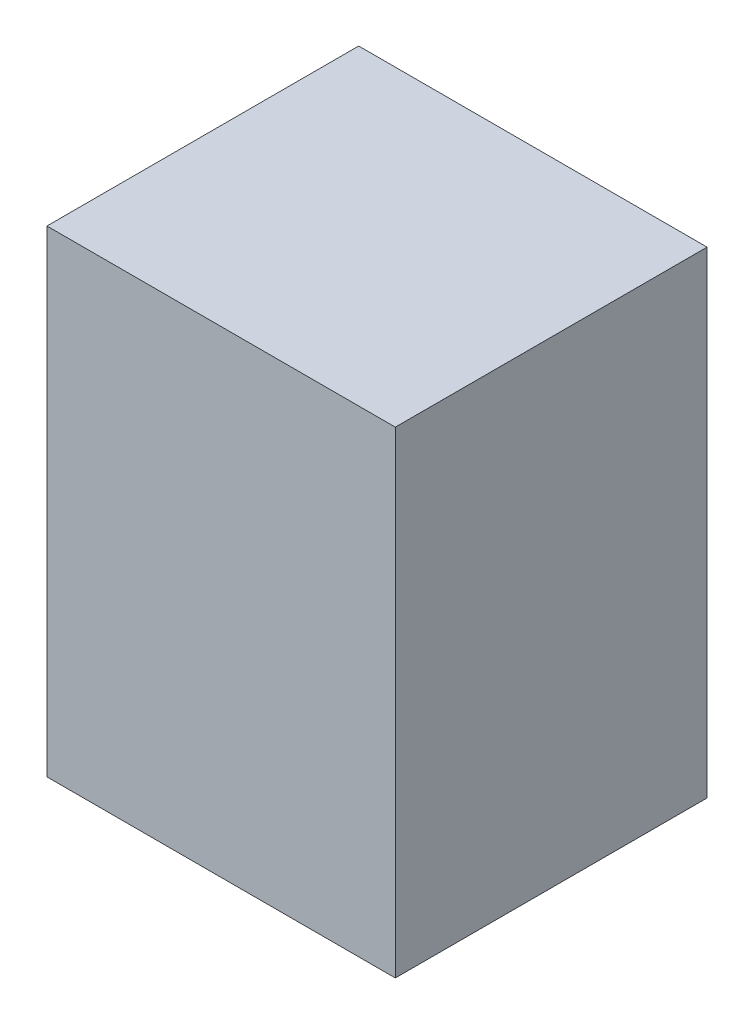
ISO-10303-21;
HEADER;
FILE_DESCRIPTION(('STEP AP214'),'2;1');
FILE_NAME('part.step','',(''),(''),'','','');
FILE_SCHEMA(('AUTOMOTIVE_DESIGN { 1 0 10303 214 1 1 1 1 }'));
ENDSEC;
DATA;
#1=APPLICATION_CONTEXT('core data for automotive mechanical design processes');
#2=APPLICATION_PROTOCOL_DEFINITION('international standard','automotive_design',2000,#1);
#3=PRODUCT_CONTEXT('',#1,'mechanical');
#4=PRODUCT('Part','Part','',(#3));
#5=PRODUCT_RELATED_PRODUCT_CATEGORY('part','',(#4));
#6=PRODUCT_DEFINITION_FORMATION('','',#4);
#7=PRODUCT_DEFINITION_CONTEXT('part definition',#1,'design');
#8=PRODUCT_DEFINITION('design','',#6,#7);
#9=PRODUCT_DEFINITION_SHAPE('','',#8);
#10=(LENGTH_UNIT() NAMED_UNIT(*) SI_UNIT(.MILLI.,.METRE.));
#11=(NAMED_UNIT(*) PLANE_ANGLE_UNIT() SI_UNIT($,.RADIAN.));
#12=(NAMED_UNIT(*) SI_UNIT($,.STERADIAN.) SOLID_ANGLE_UNIT());
#13=UNCERTAINTY_MEASURE_WITH_UNIT(LENGTH_MEASURE(1.E-05),#10,'distance_accuracy_value','');
#14=(GEOMETRIC_REPRESENTATION_CONTEXT(3) GLOBAL_UNCERTAINTY_ASSIGNED_CONTEXT((#13)) GLOBAL_UNIT_ASSIGNED_CONTEXT((#10,
#11,#12)) REPRESENTATION_CONTEXT('',''));
#15=CARTESIAN_POINT('',(0.,0.,0.));
#16=DIRECTION('',(0.,0.,1.));
#17=DIRECTION('',(1.,0.,0.));
#18=AXIS2_PLACEMENT_3D('',#15,#16,#17);
#19=CARTESIAN_POINT('',(-5.715,-6.45,14.05));
#20=DIRECTION('',(0.,0.,1.));
#21=DIRECTION('',(0.,-1.,0.));
#22=AXIS2_PLACEMENT_3D('',#19,#20,#21);
#23=PLANE('',#22);
#24=DIRECTION('',(1.,0.,0.));
#25=VECTOR('',#24,1.);
#26=CARTESIAN_POINT('',(2.135,4.3,14.05));
#27=LINE('',#26,#25);
#28=CARTESIAN_POINT('',(2.135,4.3,14.05));
#29=VERTEX_POINT('',#28);
#30=CARTESIAN_POINT('',(-13.565,4.3,14.05));
#31=VERTEX_POINT('',#30);
#32=EDGE_CURVE('E76',#29,#31,#27,.F.);
#33=ORIENTED_EDGE('',*,*,#32,.T.);
#34=DIRECTION('',(0.,1.,0.));
#35=VECTOR('',#34,1.);
#36=CARTESIAN_POINT('',(-13.565,4.3,14.05));
#37=LINE('',#36,#35);
#38=CARTESIAN_POINT('',(-13.565,-17.2,14.05));
#39=VERTEX_POINT('',#38);
#40=EDGE_CURVE('E58',#31,#39,#37,.F.);
#41=ORIENTED_EDGE('',*,*,#40,.T.);
#42=DIRECTION('',(1.,0.,0.));
#43=VECTOR('',#42,1.);
#44=CARTESIAN_POINT('',(-13.565,-17.2,14.05));
#45=LINE('',#44,#43);
#46=CARTESIAN_POINT('',(2.135,-17.2,14.05));
#47=VERTEX_POINT('',#46);
#48=EDGE_CURVE('E20',#39,#47,#45,.T.);
#49=ORIENTED_EDGE('',*,*,#48,.T.);
#50=DIRECTION('',(0.,1.,0.));
#51=VECTOR('',#50,1.);
#52=CARTESIAN_POINT('',(2.135,-17.2,14.05));
#53=LINE('',#52,#51);
#54=EDGE_CURVE('E55',#47,#29,#53,.T.);
#55=ORIENTED_EDGE('',*,*,#54,.T.);
#56=EDGE_LOOP('',(#33,#41,#49,#55));
#57=FACE_BOUND('',#56,.T.);
#58=ADVANCED_FACE('F17',(#57),#23,.T.);
#59=CARTESIAN_POINT('',(-13.565,-17.2,0.));
#60=DIRECTION('',(0.,1.,0.));
#61=DIRECTION('',(0.,0.,1.));
#62=AXIS2_PLACEMENT_3D('',#59,#60,#61);
#63=PLANE('',#62);
#64=DIRECTION('',(0.,0.,1.));
#65=VECTOR('',#64,1.);
#66=CARTESIAN_POINT('',(2.135,-17.2,0.));
#67=LINE('',#66,#65);
#68=CARTESIAN_POINT('',(2.135,-17.2,0.));
#69=VERTEX_POINT('',#68);
#70=EDGE_CURVE('E63',#69,#47,#67,.T.);
#71=ORIENTED_EDGE('',*,*,#70,.T.);
#72=ORIENTED_EDGE('',*,*,#48,.F.);
#73=DIRECTION('',(0.,0.,-1.));
#74=VECTOR('',#73,1.);
#75=CARTESIAN_POINT('',(-13.565,-17.2,0.));
#76=LINE('',#75,#74);
#77=CARTESIAN_POINT('',(-13.565,-17.2,0.));
#78=VERTEX_POINT('',#77);
#79=EDGE_CURVE('E80',#39,#78,#76,.T.);
#80=ORIENTED_EDGE('',*,*,#79,.T.);
#81=DIRECTION('',(1.,0.,0.));
#82=VECTOR('',#81,1.);
#83=CARTESIAN_POINT('',(-5.715,-17.2,0.));
#84=LINE('',#83,#82);
#85=EDGE_CURVE('E73',#78,#69,#84,.T.);
#86=ORIENTED_EDGE('',*,*,#85,.T.);
#87=EDGE_LOOP('',(#71,#72,#80,#86));
#88=FACE_BOUND('',#87,.T.);
#89=ADVANCED_FACE('F72',(#88),#63,.F.);
#90=CARTESIAN_POINT('',(2.135,-17.2,0.));
#91=DIRECTION('',(-1.,0.,0.));
#92=DIRECTION('',(0.,0.,1.));
#93=AXIS2_PLACEMENT_3D('',#90,#91,#92);
#94=PLANE('',#93);
#95=DIRECTION('',(0.,0.,-1.));
#96=VECTOR('',#95,1.);
#97=CARTESIAN_POINT('',(2.135,4.3,0.));
#98=LINE('',#97,#96);
#99=CARTESIAN_POINT('',(2.135,4.3,0.));
#100=VERTEX_POINT('',#99);
#101=EDGE_CURVE('E69',#100,#29,#98,.F.);
#102=ORIENTED_EDGE('',*,*,#101,.T.);
#103=ORIENTED_EDGE('',*,*,#54,.F.);
#104=ORIENTED_EDGE('',*,*,#70,.F.);
#105=DIRECTION('',(0.,-1.,0.));
#106=VECTOR('',#105,1.);
#107=CARTESIAN_POINT('',(2.135,-6.45,0.));
#108=LINE('',#107,#106);
#109=EDGE_CURVE('E83',#69,#100,#108,.F.);
#110=ORIENTED_EDGE('',*,*,#109,.T.);
#111=EDGE_LOOP('',(#102,#103,#104,#110));
#112=FACE_BOUND('',#111,.T.);
#113=ADVANCED_FACE('F66',(#112),#94,.F.);
#114=CARTESIAN_POINT('',(2.135,4.3,0.));
#115=DIRECTION('',(0.,-1.,0.));
#116=DIRECTION('',(0.,0.,-1.));
#117=AXIS2_PLACEMENT_3D('',#114,#115,#116);
#118=PLANE('',#117);
#119=DIRECTION('',(0.,0.,-1.));
#120=VECTOR('',#119,1.);
#121=CARTESIAN_POINT('',(-13.565,4.3,0.));
#122=LINE('',#121,#120);
#123=CARTESIAN_POINT('',(-13.565,4.3,0.));
#124=VERTEX_POINT('',#123);
#125=EDGE_CURVE('E34',#124,#31,#122,.F.);
#126=ORIENTED_EDGE('',*,*,#125,.T.);
#127=ORIENTED_EDGE('',*,*,#32,.F.);
#128=ORIENTED_EDGE('',*,*,#101,.F.);
#129=DIRECTION('',(1.,0.,0.));
#130=VECTOR('',#129,1.);
#131=CARTESIAN_POINT('',(-5.715,4.3,0.));
#132=LINE('',#131,#130);
#133=EDGE_CURVE('E26',#100,#124,#132,.F.);
#134=ORIENTED_EDGE('',*,*,#133,.T.);
#135=EDGE_LOOP('',(#126,#127,#128,#134));
#136=FACE_BOUND('',#135,.T.);
#137=ADVANCED_FACE('F88',(#136),#118,.F.);
#138=CARTESIAN_POINT('',(-13.565,4.3,0.));
#139=DIRECTION('',(1.,0.,0.));
#140=DIRECTION('',(0.,0.,-1.));
#141=AXIS2_PLACEMENT_3D('',#138,#139,#140);
#142=PLANE('',#141);
#143=ORIENTED_EDGE('',*,*,#79,.F.);
#144=ORIENTED_EDGE('',*,*,#40,.F.);
#145=ORIENTED_EDGE('',*,*,#125,.F.);
#146=DIRECTION('',(0.,-1.,0.));
#147=VECTOR('',#146,1.);
#148=CARTESIAN_POINT('',(-13.565,-6.45,0.));
#149=LINE('',#148,#147);
#150=EDGE_CURVE('E11',#124,#78,#149,.T.);
#151=ORIENTED_EDGE('',*,*,#150,.T.);
#152=EDGE_LOOP('',(#143,#144,#145,#151));
#153=FACE_BOUND('',#152,.T.);
#154=ADVANCED_FACE('F91',(#153),#142,.F.);
#155=CARTESIAN_POINT('',(-5.715,-6.45,0.));
#156=DIRECTION('',(0.,0.,1.));
#157=DIRECTION('',(0.,-1.,0.));
#158=AXIS2_PLACEMENT_3D('',#155,#156,#157);
#159=PLANE('',#158);
#160=ORIENTED_EDGE('',*,*,#133,.F.);
#161=ORIENTED_EDGE('',*,*,#109,.F.);
#162=ORIENTED_EDGE('',*,*,#85,.F.);
#163=ORIENTED_EDGE('',*,*,#150,.F.);
#164=EDGE_LOOP('',(#160,#161,#162,#163));
#165=FACE_BOUND('',#164,.T.);
#166=ADVANCED_FACE('F90',(#165),#159,.F.);
#167=CLOSED_SHELL('',(#58,#89,#113,#137,#154,#166));
#168=MANIFOLD_SOLID_BREP('B1',#167);
#169=ADVANCED_BREP_SHAPE_REPRESENTATION('',(#18,#168),#14);
#170=SHAPE_DEFINITION_REPRESENTATION(#9,#169);
ENDSEC;
END-ISO-10303-21;
